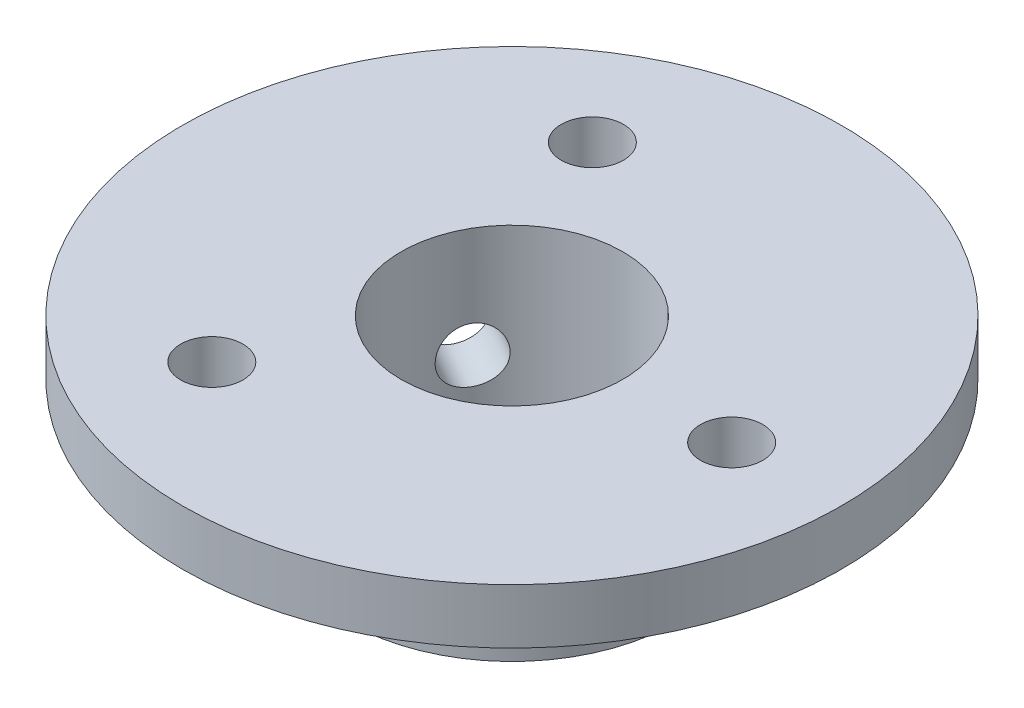
ISO-10303-21;
HEADER;
FILE_DESCRIPTION(('STEP AP214'),'2;1');
FILE_NAME('part.step','',(''),(''),'','','');
FILE_SCHEMA(('AUTOMOTIVE_DESIGN { 1 0 10303 214 1 1 1 1 }'));
ENDSEC;
DATA;
#1=APPLICATION_CONTEXT('core data for automotive mechanical design processes');
#2=APPLICATION_PROTOCOL_DEFINITION('international standard','automotive_design',2000,#1);
#3=PRODUCT_CONTEXT('',#1,'mechanical');
#4=PRODUCT('Part','Part','',(#3));
#5=PRODUCT_RELATED_PRODUCT_CATEGORY('part','',(#4));
#6=PRODUCT_DEFINITION_FORMATION('','',#4);
#7=PRODUCT_DEFINITION_CONTEXT('part definition',#1,'design');
#8=PRODUCT_DEFINITION('design','',#6,#7);
#9=PRODUCT_DEFINITION_SHAPE('','',#8);
#10=(LENGTH_UNIT() NAMED_UNIT(*) SI_UNIT(.MILLI.,.METRE.));
#11=(NAMED_UNIT(*) PLANE_ANGLE_UNIT() SI_UNIT($,.RADIAN.));
#12=(NAMED_UNIT(*) SI_UNIT($,.STERADIAN.) SOLID_ANGLE_UNIT());
#13=UNCERTAINTY_MEASURE_WITH_UNIT(LENGTH_MEASURE(1.E-05),#10,'distance_accuracy_value','');
#14=(GEOMETRIC_REPRESENTATION_CONTEXT(3) GLOBAL_UNCERTAINTY_ASSIGNED_CONTEXT((#13)) GLOBAL_UNIT_ASSIGNED_CONTEXT((#10,
#11,#12)) REPRESENTATION_CONTEXT('',''));
#15=CARTESIAN_POINT('',(0.,0.,0.));
#16=DIRECTION('',(0.,0.,1.));
#17=DIRECTION('',(1.,0.,0.));
#18=AXIS2_PLACEMENT_3D('',#15,#16,#17);
#19=CARTESIAN_POINT('',(-19.0091828831705,-263.,-53.2448828787845));
#20=DIRECTION('',(0.,-1.,0.));
#21=DIRECTION('',(0.,0.,-1.));
#22=AXIS2_PLACEMENT_3D('',#19,#20,#21);
#23=CYLINDRICAL_SURFACE('',#22,9.);
#24=CARTESIAN_POINT('',(-19.0091828831705,-273.,-53.2448828787845));
#25=DIRECTION('',(0.,1.,0.));
#26=DIRECTION('',(0.,0.,1.));
#27=AXIS2_PLACEMENT_3D('',#24,#25,#26);
#28=CIRCLE('',#27,9.);
#29=CARTESIAN_POINT('',(-19.0091828831705,-273.,-44.2448828787845));
#30=VERTEX_POINT('',#29);
#31=EDGE_CURVE('E55',#30,#30,#28,.T.);
#32=ORIENTED_EDGE('',*,*,#31,.T.);
#33=EDGE_LOOP('',(#32));
#34=FACE_BOUND('',#33,.T.);
#35=CARTESIAN_POINT('',(-19.0091828831705,-266.,-53.2448828787845));
#36=DIRECTION('',(0.,1.,0.));
#37=DIRECTION('',(0.,0.,1.));
#38=AXIS2_PLACEMENT_3D('',#35,#36,#37);
#39=CIRCLE('',#38,9.);
#40=CARTESIAN_POINT('',(-19.0091828831705,-266.,-44.2448828787845));
#41=VERTEX_POINT('',#40);
#42=EDGE_CURVE('E10',#41,#41,#39,.T.);
#43=ORIENTED_EDGE('',*,*,#42,.F.);
#44=EDGE_LOOP('',(#43));
#45=FACE_BOUND('',#44,.T.);
#46=CARTESIAN_POINT('',(-27.4443959576402,-269.,-56.3829046104325));
#47=CARTESIAN_POINT('',(-27.4443955846555,-268.916374551112,-56.3829082759775));
#48=CARTESIAN_POINT('',(-27.4419223053393,-268.832703436385,-56.389578863176));
#49=CARTESIAN_POINT('',(-27.4320125045344,-268.667708874068,-56.4160235195044));
#50=CARTESIAN_POINT('',(-27.4245714058764,-268.58638766375,-56.435809672723));
#51=CARTESIAN_POINT('',(-27.4047027066641,-268.428504629986,-56.4877233004097));
#52=CARTESIAN_POINT('',(-27.3922792732431,-268.3519388908,-56.5198404604949));
#53=CARTESIAN_POINT('',(-27.3624238402235,-268.205611427172,-56.5952563986755));
#54=CARTESIAN_POINT('',(-27.3449924042401,-268.135848938254,-56.6385539184453));
#55=CARTESIAN_POINT('',(-27.3049570017537,-268.004412290153,-56.7352822711148));
#56=CARTESIAN_POINT('',(-27.2823087569628,-267.942814921168,-56.7887991358885));
#57=CARTESIAN_POINT('',(-27.2320296164232,-267.830124015883,-56.9039443219727));
#58=CARTESIAN_POINT('',(-27.2043984255415,-267.779031102131,-56.9655731236835));
#59=CARTESIAN_POINT('',(-27.1442291954822,-267.688511259668,-57.0953581877246));
#60=CARTESIAN_POINT('',(-27.1116628481623,-267.649155795361,-57.1635512212972));
#61=CARTESIAN_POINT('',(-27.042228374785,-267.583687357682,-57.303984791282));
#62=CARTESIAN_POINT('',(-27.0053605286255,-267.557573523269,-57.376225064182));
#63=CARTESIAN_POINT('',(-26.9284317459557,-267.51956447901,-57.5218223073512));
#64=CARTESIAN_POINT('',(-26.8884034241198,-267.507540250397,-57.5951628151509));
#65=CARTESIAN_POINT('',(-26.8058722650729,-267.497650547508,-57.7414016906102));
#66=CARTESIAN_POINT('',(-26.763369596251,-267.499784110852,-57.8143000879852));
#67=CARTESIAN_POINT('',(-26.6775772460358,-267.518048810917,-57.9568445310038));
#68=CARTESIAN_POINT('',(-26.6342995292368,-267.534041098046,-58.0265156384673));
#69=CARTESIAN_POINT('',(-26.5479566930274,-267.579350644548,-58.1615193586023));
#70=CARTESIAN_POINT('',(-26.5048915801325,-267.608668309754,-58.226851839069));
#71=CARTESIAN_POINT('',(-26.4202928553399,-267.679934384189,-58.3518562486502));
#72=CARTESIAN_POINT('',(-26.3787671579525,-267.721940007249,-58.4115008921241));
#73=CARTESIAN_POINT('',(-26.2990161854585,-267.817347693581,-58.523430077372));
#74=CARTESIAN_POINT('',(-26.2607911778246,-267.870750679227,-58.5757140228853));
#75=CARTESIAN_POINT('',(-26.1887295067824,-267.988207283972,-58.6723865701703));
#76=CARTESIAN_POINT('',(-26.1549517092287,-268.052382256941,-58.7166716896824));
#77=CARTESIAN_POINT('',(-26.0937997144255,-268.18915225413,-58.7956220923109));
#78=CARTESIAN_POINT('',(-26.066425576245,-268.26174735601,-58.8302872866911));
#79=CARTESIAN_POINT('',(-26.0193142215111,-268.413434985127,-58.8893042877897));
#80=CARTESIAN_POINT('',(-25.9995855931814,-268.492534698855,-58.9136444993096));
#81=CARTESIAN_POINT('',(-25.9687753955772,-268.654909443385,-58.9514293115988));
#82=CARTESIAN_POINT('',(-25.9576930649258,-268.73818410586,-58.9648748717346));
#83=CARTESIAN_POINT('',(-25.9448151899855,-268.905479693697,-58.9804828538303));
#84=CARTESIAN_POINT('',(-25.9429103119665,-268.989479827821,-58.98277811538));
#85=CARTESIAN_POINT('',(-25.9481869744816,-269.156772003015,-58.9763956560938));
#86=CARTESIAN_POINT('',(-25.9553681640573,-269.240064071308,-58.9677183590838));
#87=CARTESIAN_POINT('',(-25.9783808858867,-269.403036655515,-58.9396700995327));
#88=CARTESIAN_POINT('',(-25.9941574120271,-269.482736683927,-58.9203671282506));
#89=CARTESIAN_POINT('',(-26.0335649390486,-269.636882099768,-58.8715191422945));
#90=CARTESIAN_POINT('',(-26.0571964097995,-269.711327172531,-58.8419735149173));
#91=CARTESIAN_POINT('',(-26.1114846218793,-269.853604756644,-58.7729249574249));
#92=CARTESIAN_POINT('',(-26.1422041504897,-269.921369943654,-58.7333326995224));
#93=CARTESIAN_POINT('',(-26.2092002877539,-270.047668119617,-58.6451429188243));
#94=CARTESIAN_POINT('',(-26.2454772872466,-270.106200458666,-58.5965447626223));
#95=CARTESIAN_POINT('',(-26.3224923998484,-270.212991135637,-58.4908162898407));
#96=CARTESIAN_POINT('',(-26.3632729839541,-270.261136295771,-58.433602496924));
#97=CARTESIAN_POINT('',(-26.4473588613692,-270.344993196203,-58.3123255181014));
#98=CARTESIAN_POINT('',(-26.490664072959,-270.380705338684,-58.2482625538398));
#99=CARTESIAN_POINT('',(-26.5779837345088,-270.438506350373,-58.115155549931));
#100=CARTESIAN_POINT('',(-26.6219942274918,-270.460654445441,-58.0461346567948));
#101=CARTESIAN_POINT('',(-26.7093803081369,-270.490889359378,-57.9046967084631));
#102=CARTESIAN_POINT('',(-26.7527559477492,-270.498977335239,-57.8322799332145));
#103=CARTESIAN_POINT('',(-26.8369936083392,-270.500829129387,-57.6869934454136));
#104=CARTESIAN_POINT('',(-26.8778797003691,-270.494765152365,-57.6141398263318));
#105=CARTESIAN_POINT('',(-26.9566077376737,-270.468857646638,-57.4692453820966));
#106=CARTESIAN_POINT('',(-26.994449699993,-270.449014195094,-57.3972045523942));
#107=CARTESIAN_POINT('',(-27.0662175392359,-270.396177100674,-57.2561733620671));
#108=CARTESIAN_POINT('',(-27.1001477222312,-270.363198099074,-57.1871796997767));
#109=CARTESIAN_POINT('',(-27.1635774092855,-270.285045238262,-57.05425033712));
#110=CARTESIAN_POINT('',(-27.1930767032088,-270.239870800963,-56.9903148767077));
#111=CARTESIAN_POINT('',(-27.2476192889897,-270.137998944523,-56.8687840044083));
#112=CARTESIAN_POINT('',(-27.2726076517893,-270.081175427146,-56.8112696296225));
#113=CARTESIAN_POINT('',(-27.3175452583329,-269.957883015261,-56.7052927569666));
#114=CARTESIAN_POINT('',(-27.3374933204094,-269.891411864665,-56.6568323824438));
#115=CARTESIAN_POINT('',(-27.3724177907865,-269.750152806495,-56.5703152260012));
#116=CARTESIAN_POINT('',(-27.3873580339418,-269.675309396097,-56.5323344587124));
#117=CARTESIAN_POINT('',(-27.4120729545346,-269.519834458453,-56.468640867427));
#118=CARTESIAN_POINT('',(-27.4218527931616,-269.439208806382,-56.4429157883894));
#119=CARTESIAN_POINT('',(-27.4341856321772,-269.298557738314,-56.4102470016508));
#120=CARTESIAN_POINT('',(-27.4380145649149,-269.239383915225,-56.4000136386093));
#121=CARTESIAN_POINT('',(-27.4431198384733,-269.120147909095,-56.3863411878055));
#122=CARTESIAN_POINT('',(-27.4443962256336,-269.060085742202,-56.3829019767009));
#123=CARTESIAN_POINT('',(-27.4443959576402,-269.,-56.3829046104325));
#124=B_SPLINE_CURVE_WITH_KNOTS('',3,(#46,#47,#48,#49,#50,#51,#52,#53,#54,#55,#56,#57,#58,#59,
#60,#61,#62,#63,#64,#65,#66,#67,#68,#69,#70,#71,#72,#73,#74,#75,#76,#77,#78,#79,#80,#81,#82,#83,
#84,#85,#86,#87,#88,#89,#90,#91,#92,#93,#94,#95,#96,#97,#98,#99,#100,#101,#102,#103,#104,#105,
#106,#107,#108,#109,#110,#111,#112,#113,#114,#115,#116,#117,#118,#119,#120,#121,#122,#123),
.UNSPECIFIED.,.T.,.F.,(4,2,2,2,2,2,2,2,2,2,2,2,2,2,2,2,2,2,2,2,2,2,2,2,2,2,2,2,2,2,2,2,2,2,2,2,
2,2,4),(0.,0.250656623343192,0.501544511951688,0.75222299869901,1.00287328440552,
1.25573495490819,1.5086116069806,1.76299788064252,2.01736761064057,2.26938940480931,
2.52139406789009,2.77090272696194,3.02041898547112,3.27107762481046,3.52175655733452,
3.77547674074667,4.02919926444999,4.28320597496554,4.5371903156024,4.78814125449642,
5.03908250045775,5.28843638778686,5.53780519373538,5.7894740565501,6.04116062655806,
6.29546467818619,6.54976050283407,6.80293790647976,7.05609447544802,7.30618665756942,
7.55627743928687,7.80609023896866,8.05591488232793,8.30860198475348,8.56134827326482,
8.81588236567711,9.07016140042584,9.25026402322166,9.43036337636995),.UNSPECIFIED.);
#125=CARTESIAN_POINT('',(-27.4443959576402,-269.,-56.3829046104325));
#126=VERTEX_POINT('',#125);
#127=EDGE_CURVE('E100',#126,#126,#124,.T.);
#128=ORIENTED_EDGE('',*,*,#127,.F.);
#129=EDGE_LOOP('',(#128));
#130=FACE_BOUND('',#129,.T.);
#131=CARTESIAN_POINT('',(-12.0739698087008,-269.,-47.5087849357831));
#132=CARTESIAN_POINT('',(-12.0739668207381,-269.083625448888,-47.5087870915698));
#133=CARTESIAN_POINT('',(-12.0694265624242,-269.167296563615,-47.5142643078876));
#134=CARTESIAN_POINT('',(-12.0514797186519,-269.332291125932,-47.5360687752953));
#135=CARTESIAN_POINT('',(-12.0380649566504,-269.41361233625,-47.5524060323744));
#136=CARTESIAN_POINT('',(-12.0030407858772,-269.571495370014,-47.5955696444758));
#137=CARTESIAN_POINT('',(-11.9814382260566,-269.6480611092,-47.6223872334632));
#138=CARTESIAN_POINT('',(-11.9310538242517,-269.794388572828,-47.6859507659894));
#139=CARTESIAN_POINT('',(-11.9022727902019,-269.864151061746,-47.7226955922605));
#140=CARTESIAN_POINT('',(-11.8385212807671,-269.995587709847,-47.8057314441991));
#141=CARTESIAN_POINT('',(-11.8034984387377,-270.057185078832,-47.8521038319261));
#142=CARTESIAN_POINT('',(-11.7289193527351,-270.169875984117,-47.9532194379559));
#143=CARTESIAN_POINT('',(-11.6893628402895,-270.220968897869,-48.0079631520517));
#144=CARTESIAN_POINT('',(-11.6070502928279,-270.311488740332,-48.1249637658297));
#145=CARTESIAN_POINT('',(-11.5642765670528,-270.350844204639,-48.1872635667035));
#146=CARTESIAN_POINT('',(-11.4773747645904,-270.416312642318,-48.3176123695391));
#147=CARTESIAN_POINT('',(-11.4332467761624,-270.442426476731,-48.385660997346));
#148=CARTESIAN_POINT('',(-11.3456202561919,-270.48043552099,-48.5250818990049));
#149=CARTESIAN_POINT('',(-11.3021196742288,-270.492459749603,-48.5964176964855));
#150=CARTESIAN_POINT('',(-11.2167386725836,-270.502349452492,-48.7410112145535));
#151=CARTESIAN_POINT('',(-11.1748581429726,-270.500215889148,-48.8142688041694));
#152=CARTESIAN_POINT('',(-11.0943072092579,-270.481951189083,-48.9598393804154));
#153=CARTESIAN_POINT('',(-11.0556091186842,-270.465958901955,-49.0321545363129));
#154=CARTESIAN_POINT('',(-10.9818638855465,-270.420649355452,-49.1744314859725));
#155=CARTESIAN_POINT('',(-10.9468168542176,-270.391331690246,-49.2443932079897));
#156=CARTESIAN_POINT('',(-10.8808592223315,-270.320065615811,-49.3801600575784));
#157=CARTESIAN_POINT('',(-10.8499682945772,-270.278059992751,-49.4459446881628));
#158=CARTESIAN_POINT('',(-10.7929102629745,-270.182652306419,-49.570975648943));
#159=CARTESIAN_POINT('',(-10.7667435417669,-270.129249320773,-49.6302214493705));
#160=CARTESIAN_POINT('',(-10.7190534954907,-270.011792716028,-49.7409649607747));
#161=CARTESIAN_POINT('',(-10.6975903557604,-269.947617743059,-49.7923599512962));
#162=CARTESIAN_POINT('',(-10.6597932988467,-269.81084774587,-49.8847943336021));
#163=CARTESIAN_POINT('',(-10.6434594289765,-269.73825264399,-49.9258336298632));
#164=CARTESIAN_POINT('',(-10.615904884137,-269.586565014873,-49.9961417604188));
#165=CARTESIAN_POINT('',(-10.6046899567921,-269.507465301145,-50.025397359494));
#166=CARTESIAN_POINT('',(-10.5873724482745,-269.345090556616,-50.0709721794595));
#167=CARTESIAN_POINT('',(-10.5812694169545,-269.261815894141,-50.0872925394047));
#168=CARTESIAN_POINT('',(-10.574191445428,-269.094520306303,-50.1062490972976));
#169=CARTESIAN_POINT('',(-10.5731561296271,-269.010520172179,-50.109046400828));
#170=CARTESIAN_POINT('',(-10.57604517025,-268.843227996985,-50.1012854473996));
#171=CARTESIAN_POINT('',(-10.579969335109,-268.759935928692,-50.0907277062927));
#172=CARTESIAN_POINT('',(-10.5927534794975,-268.596963344485,-50.0567739748026));
#173=CARTESIAN_POINT('',(-10.6015820799261,-268.517263316073,-50.0334596167405));
#174=CARTESIAN_POINT('',(-10.6241819131771,-268.363117900232,-49.9749077042615));
#175=CARTESIAN_POINT('',(-10.637953441681,-268.288672827469,-49.9396694365739));
#176=CARTESIAN_POINT('',(-10.6706071405242,-268.146395243356,-49.8581301870405));
#177=CARTESIAN_POINT('',(-10.6895352773557,-268.078630056346,-49.8117301659203));
#178=CARTESIAN_POINT('',(-10.7324117991624,-267.952331880383,-49.7096149187451));
#179=CARTESIAN_POINT('',(-10.756360537264,-267.893799541334,-49.6538990375103));
#180=CARTESIAN_POINT('',(-10.8094165242954,-267.787008864363,-49.5343377571311));
#181=CARTESIAN_POINT('',(-10.8385748303552,-267.738863704229,-49.470413838856));
#182=CARTESIAN_POINT('',(-10.9015608362023,-267.655006803797,-49.3369548435037));
#183=CARTESIAN_POINT('',(-10.9353883848997,-267.619294661316,-49.2674199480199));
#184=CARTESIAN_POINT('',(-11.0070026009314,-267.561493649627,-49.1252454009135));
#185=CARTESIAN_POINT('',(-11.0447712012877,-267.539345554559,-49.0526207493891));
#186=CARTESIAN_POINT('',(-11.1235670172796,-267.509110640622,-48.9062232094474));
#187=CARTESIAN_POINT('',(-11.1645939644989,-267.501022664761,-48.8324504160134));
#188=CARTESIAN_POINT('',(-11.2482969234661,-267.499170870613,-48.6868552180867));
#189=CARTESIAN_POINT('',(-11.2909469623336,-267.505234847635,-48.6150200141864));
#190=CARTESIAN_POINT('',(-11.3770652132562,-267.531142353362,-48.4743923117729));
#191=CARTESIAN_POINT('',(-11.4205334207286,-267.550985804906,-48.4055997962242));
#192=CARTESIAN_POINT('',(-11.5067860946564,-267.603822899326,-48.2729314291016));
#193=CARTESIAN_POINT('',(-11.5495712674023,-267.636801900926,-48.2090501975274));
#194=CARTESIAN_POINT('',(-11.6329766288447,-267.714954761738,-48.0876537958559));
#195=CARTESIAN_POINT('',(-11.6735967148027,-267.760129199037,-48.0301389277185));
#196=CARTESIAN_POINT('',(-11.7515742446677,-267.862001055477,-47.9221382266944));
#197=CARTESIAN_POINT('',(-11.7888889729152,-267.918824572854,-47.8717404823181));
#198=CARTESIAN_POINT('',(-11.858198833577,-268.042116984739,-47.7798349371381));
#199=CARTESIAN_POINT('',(-11.8901927179524,-268.108588135335,-47.7383292213622));
#200=CARTESIAN_POINT('',(-11.9476565381064,-268.249847193505,-47.6648251645806));
#201=CARTESIAN_POINT('',(-11.973078725856,-268.324690603903,-47.632896150825));
#202=CARTESIAN_POINT('',(-12.015881533671,-268.480165541547,-47.5796456060964));
#203=CARTESIAN_POINT('',(-12.0332701863185,-268.560791193618,-47.5583134778818));
#204=CARTESIAN_POINT('',(-12.0553957660371,-268.701442261686,-47.5312985326241));
#205=CARTESIAN_POINT('',(-12.0623436520284,-268.760616084775,-47.5228658980832));
#206=CARTESIAN_POINT('',(-12.0716317049772,-268.879852090905,-47.5116083760864));
#207=CARTESIAN_POINT('',(-12.0739719555826,-268.939914257798,-47.5087833868283));
#208=CARTESIAN_POINT('',(-12.0739698087008,-269.,-47.5087849357831));
#209=B_SPLINE_CURVE_WITH_KNOTS('',3,(#131,#132,#133,#134,#135,#136,#137,#138,#139,#140,#141,
#142,#143,#144,#145,#146,#147,#148,#149,#150,#151,#152,#153,#154,#155,#156,#157,#158,#159,#160,
#161,#162,#163,#164,#165,#166,#167,#168,#169,#170,#171,#172,#173,#174,#175,#176,#177,#178,#179,
#180,#181,#182,#183,#184,#185,#186,#187,#188,#189,#190,#191,#192,#193,#194,#195,#196,#197,#198,
#199,#200,#201,#202,#203,#204,#205,#206,#207,#208),.UNSPECIFIED.,.T.,.F.,(4,2,2,2,2,2,2,2,2,2,2,
2,2,2,2,2,2,2,2,2,2,2,2,2,2,2,2,2,2,2,2,2,2,2,2,2,2,2,4),(0.,0.250656623343192,
0.501544511951688,0.75222299869901,1.00287328440552,1.25573495490819,1.5086116069806,
1.76299788064251,2.01736761064058,2.26938940480931,2.52139406789008,2.77090272696194,
3.02041898547112,3.27107762481046,3.52175655733452,3.77547674074669,4.02919926445006,
4.28320597496555,4.53719031560235,4.78814125449637,5.03908250045781,5.28843638778687,
5.53780519373538,5.78947405655011,6.04116062655806,6.2954646781862,6.54976050283408,
6.80293790647979,7.05609447544804,7.30618665756944,7.55627743928688,7.80609023896868,
8.05591488232794,8.30860198475347,8.56134827326483,8.81588236567717,9.07016140042584,
9.25026402322172,9.43036337636996),.UNSPECIFIED.);
#210=CARTESIAN_POINT('',(-12.0739698087008,-269.,-47.5087849357831));
#211=VERTEX_POINT('',#210);
#212=EDGE_CURVE('E69',#211,#211,#209,.T.);
#213=ORIENTED_EDGE('',*,*,#212,.F.);
#214=EDGE_LOOP('',(#213));
#215=FACE_BOUND('',#214,.T.);
#216=ADVANCED_FACE('F39',(#34,#45,#130,#215),#23,.T.);
#217=CARTESIAN_POINT('',(-19.0091828831705,-262.9,-53.2448828787845));
#218=DIRECTION('',(0.,-1.,0.));
#219=DIRECTION('',(0.,0.,-1.));
#220=AXIS2_PLACEMENT_3D('',#217,#218,#219);
#221=CYLINDRICAL_SURFACE('',#220,6.05);
#222=CARTESIAN_POINT('',(-24.8350448789305,-269.,-54.8763950627292));
#223=CARTESIAN_POINT('',(-24.8350450633985,-268.917145871372,-54.8763979320863));
#224=CARTESIAN_POINT('',(-24.8331388938054,-268.83426511614,-54.8832484358918));
#225=CARTESIAN_POINT('',(-24.8254452254222,-268.670882052661,-54.9103509568516));
#226=CARTESIAN_POINT('',(-24.8196554299351,-268.590381181258,-54.930610903983));
#227=CARTESIAN_POINT('',(-24.8040130372753,-268.434144766549,-54.9836182037655));
#228=CARTESIAN_POINT('',(-24.7941656282341,-268.358403279826,-55.0163496061995));
#229=CARTESIAN_POINT('',(-24.7701365726022,-268.213569094319,-55.092995111845));
#230=CARTESIAN_POINT('',(-24.7559547606416,-268.144476649346,-55.136909641714));
#231=CARTESIAN_POINT('',(-24.7226346416272,-268.013406159432,-55.2352876924835));
#232=CARTESIAN_POINT('',(-24.7034050162067,-267.951593249911,-55.2899403392969));
#233=CARTESIAN_POINT('',(-24.6598652875304,-267.838290682976,-55.4073354940556));
#234=CARTESIAN_POINT('',(-24.6355547156717,-267.786801978596,-55.4700787479727));
#235=CARTESIAN_POINT('',(-24.5813733602019,-267.694935328621,-55.6025030570667));
#236=CARTESIAN_POINT('',(-24.5514309218313,-267.654719373618,-55.6722674293788));
#237=CARTESIAN_POINT('',(-24.4863792754456,-267.587592712703,-55.8156824422294));
#238=CARTESIAN_POINT('',(-24.451270817782,-267.560680076987,-55.8893325173844));
#239=CARTESIAN_POINT('',(-24.3771809586197,-267.521452276688,-56.0366123488901));
#240=CARTESIAN_POINT('',(-24.3382907397042,-267.508856747212,-56.1102132286142));
#241=CARTESIAN_POINT('',(-24.2569934948733,-267.497740893098,-56.2565241740754));
#242=CARTESIAN_POINT('',(-24.2145869815761,-267.499218520387,-56.3292343678923));
#243=CARTESIAN_POINT('',(-24.1285014330235,-267.516004889703,-56.4700563567304));
#244=CARTESIAN_POINT('',(-24.0848703763516,-267.531011035916,-56.5382338805729));
#245=CARTESIAN_POINT('',(-23.9969491341835,-267.573942381363,-56.6699318903674));
#246=CARTESIAN_POINT('',(-23.9526589140462,-267.601868261907,-56.7334521305176));
#247=CARTESIAN_POINT('',(-23.8646572595089,-267.670092763352,-56.8549452882894));
#248=CARTESIAN_POINT('',(-23.8209545153478,-267.710499557116,-56.9128636528494));
#249=CARTESIAN_POINT('',(-23.736264902453,-267.802456929857,-57.0213813356442));
#250=CARTESIAN_POINT('',(-23.6952785008274,-267.854009419009,-57.0719793968246));
#251=CARTESIAN_POINT('',(-23.6167176125377,-267.968418739372,-57.1662338103556));
#252=CARTESIAN_POINT('',(-23.5792630410344,-268.031540031227,-57.2096694401291));
#253=CARTESIAN_POINT('',(-23.5108334886642,-268.166447544473,-57.2871994740126));
#254=CARTESIAN_POINT('',(-23.4798588005152,-268.238234157074,-57.3212934561507));
#255=CARTESIAN_POINT('',(-23.4258881891325,-268.388921008808,-57.3797118605887));
#256=CARTESIAN_POINT('',(-23.402930465209,-268.467853107807,-57.403989594661));
#257=CARTESIAN_POINT('',(-23.366540965744,-268.630299513716,-57.4421000954008));
#258=CARTESIAN_POINT('',(-23.3531071897388,-268.713812854385,-57.4559350555668));
#259=CARTESIAN_POINT('',(-23.3368161357506,-268.88072474514,-57.4726747893412));
#260=CARTESIAN_POINT('',(-23.3336930087933,-268.964069849902,-57.4758543346462));
#261=CARTESIAN_POINT('',(-23.3374677961823,-269.130289310283,-57.4719926504449));
#262=CARTESIAN_POINT('',(-23.3443648049192,-269.213163707763,-57.4649523445981));
#263=CARTESIAN_POINT('',(-23.3675655787072,-269.374718130252,-57.4409844251751));
#264=CARTESIAN_POINT('',(-23.3837167785055,-269.453444096,-57.424217117048));
#265=CARTESIAN_POINT('',(-23.4243967755724,-269.605990866611,-57.3812166133983));
#266=CARTESIAN_POINT('',(-23.4489265526,-269.679811096609,-57.3549823108211));
#267=CARTESIAN_POINT('',(-23.5056335718447,-269.822024713169,-57.2928733449973));
#268=CARTESIAN_POINT('',(-23.5379494671799,-269.89028562448,-57.2568221448304));
#269=CARTESIAN_POINT('',(-23.6083755456353,-270.018024313333,-57.1758876509572));
#270=CARTESIAN_POINT('',(-23.6464866644314,-270.077500669491,-57.1310029306775));
#271=CARTESIAN_POINT('',(-23.727772536656,-270.187479914155,-57.0319147257517));
#272=CARTESIAN_POINT('',(-23.7710486775083,-270.237726490308,-56.9775094175847));
#273=CARTESIAN_POINT('',(-23.8599666809402,-270.325960338467,-56.8611996532621));
#274=CARTESIAN_POINT('',(-23.9056084205376,-270.363948247033,-56.7992955867269));
#275=CARTESIAN_POINT('',(-23.9970265289423,-270.426259322716,-56.6698127715526));
#276=CARTESIAN_POINT('',(-24.0427994860794,-270.450680162875,-56.6022787192659));
#277=CARTESIAN_POINT('',(-24.1330462688226,-270.485458073156,-56.4628653761341));
#278=CARTESIAN_POINT('',(-24.1775203391816,-270.495817809803,-56.3909869118577));
#279=CARTESIAN_POINT('',(-24.2624923341831,-270.502031514408,-56.2468908046009));
#280=CARTESIAN_POINT('',(-24.3030645594155,-270.498264033302,-56.1747330503417));
#281=CARTESIAN_POINT('',(-24.3804265364585,-270.477195886485,-56.030371866503));
#282=CARTESIAN_POINT('',(-24.4172163973577,-270.459895611202,-55.9581684383013));
#283=CARTESIAN_POINT('',(-24.486095370606,-270.412454589756,-55.8162875322755));
#284=CARTESIAN_POINT('',(-24.5182079972697,-270.382381278526,-55.7465988450935));
#285=CARTESIAN_POINT('',(-24.5775998405927,-270.310309234355,-55.6114599557539));
#286=CARTESIAN_POINT('',(-24.6048784561424,-270.268309019989,-55.5460102813589));
#287=CARTESIAN_POINT('',(-24.6551214184374,-270.172415313698,-55.4198771609174));
#288=CARTESIAN_POINT('',(-24.6779686269354,-270.118264305729,-55.3593428307888));
#289=CARTESIAN_POINT('',(-24.7186879397711,-270.000107510859,-55.2467925003856));
#290=CARTESIAN_POINT('',(-24.7365587866343,-269.936099239464,-55.1947786545129));
#291=CARTESIAN_POINT('',(-24.7678858849438,-269.798637306859,-55.1002456268818));
#292=CARTESIAN_POINT('',(-24.7812555255557,-269.725032456485,-55.0579172542834));
#293=CARTESIAN_POINT('',(-24.803444606581,-269.571354258327,-54.9857068801794));
#294=CARTESIAN_POINT('',(-24.8122673975113,-269.491285724021,-54.9558157169866));
#295=CARTESIAN_POINT('',(-24.8243633753481,-269.34278419005,-54.9141780976986));
#296=CARTESIAN_POINT('',(-24.8283768790743,-269.275069134371,-54.9000496540044));
#297=CARTESIAN_POINT('',(-24.8337174434205,-269.138242154339,-54.8811573246245));
#298=CARTESIAN_POINT('',(-24.8350447250173,-269.069130345359,-54.8763926686464));
#299=CARTESIAN_POINT('',(-24.8350448789305,-269.,-54.8763950627292));
#300=B_SPLINE_CURVE_WITH_KNOTS('',3,(#222,#223,#224,#225,#226,#227,#228,#229,#230,#231,#232,
#233,#234,#235,#236,#237,#238,#239,#240,#241,#242,#243,#244,#245,#246,#247,#248,#249,#250,#251,
#252,#253,#254,#255,#256,#257,#258,#259,#260,#261,#262,#263,#264,#265,#266,#267,#268,#269,#270,
#271,#272,#273,#274,#275,#276,#277,#278,#279,#280,#281,#282,#283,#284,#285,#286,#287,#288,#289,
#290,#291,#292,#293,#294,#295,#296,#297,#298,#299),.UNSPECIFIED.,.T.,.F.,(4,2,2,2,2,2,2,2,2,2,2,
2,2,2,2,2,2,2,2,2,2,2,2,2,2,2,2,2,2,2,2,2,2,2,2,2,2,2,4),(0.,0.248308555378135,
0.496764084985487,0.744902916216995,0.993051215830459,1.24604175182043,1.49905563079245,
1.75553800799941,2.01198316847504,2.26331496642091,2.51461018850565,2.7604203878838,
3.00624355129862,3.25426007800213,3.50231914408442,3.75698358308596,4.01165952364873,
4.26753289950156,4.52335251433646,4.77252234046924,5.0216696482933,5.26682305522699,
5.5120051392892,5.76192634197366,6.01188793896218,6.26798960627747,6.52407797276703,
6.77829797232378,7.03246975527181,7.27988006564556,7.52728323836721,7.77339617740614,
8.01953969916321,8.271497849543,8.52351960945305,8.78014536003374,9.03658173491867,
9.24377802972126,9.45095727924298),.UNSPECIFIED.);
#301=CARTESIAN_POINT('',(-24.8350448789305,-269.,-54.8763950627292));
#302=VERTEX_POINT('',#301);
#303=EDGE_CURVE('E80',#302,#302,#300,.T.);
#304=ORIENTED_EDGE('',*,*,#303,.T.);
#305=EDGE_LOOP('',(#304));
#306=FACE_BOUND('',#305,.T.);
#307=CARTESIAN_POINT('',(-19.0091828831705,-263.,-53.2448828787845));
#308=DIRECTION('',(0.,1.,0.));
#309=DIRECTION('',(0.,0.,1.));
#310=AXIS2_PLACEMENT_3D('',#307,#308,#309);
#311=CIRCLE('',#310,6.05);
#312=CARTESIAN_POINT('',(-19.0091828831705,-263.,-47.1948828787845));
#313=VERTEX_POINT('',#312);
#314=EDGE_CURVE('E62',#313,#313,#311,.F.);
#315=ORIENTED_EDGE('',*,*,#314,.F.);
#316=EDGE_LOOP('',(#315));
#317=FACE_BOUND('',#316,.T.);
#318=CARTESIAN_POINT('',(-19.0091828831705,-273.,-53.2448828787845));
#319=DIRECTION('',(0.,1.,0.));
#320=DIRECTION('',(0.,0.,1.));
#321=AXIS2_PLACEMENT_3D('',#318,#319,#320);
#322=CIRCLE('',#321,6.05);
#323=CARTESIAN_POINT('',(-19.0091828831705,-273.,-47.1948828787845));
#324=VERTEX_POINT('',#323);
#325=EDGE_CURVE('E61',#324,#324,#322,.F.);
#326=ORIENTED_EDGE('',*,*,#325,.T.);
#327=EDGE_LOOP('',(#326));
#328=FACE_BOUND('',#327,.T.);
#329=CARTESIAN_POINT('',(-14.6833208874106,-269.,-49.0152944834864));
#330=CARTESIAN_POINT('',(-14.6833183102404,-269.082854128628,-49.0152957584109));
#331=CARTESIAN_POINT('',(-14.6783386847127,-269.16573488386,-49.0203718016053));
#332=CARTESIAN_POINT('',(-14.6587140472465,-269.329117947339,-49.0405859743533));
#333=CARTESIAN_POINT('',(-14.644063316095,-269.409618818742,-49.0557300578936));
#334=CARTESIAN_POINT('',(-14.6059788442272,-269.565855233451,-49.0957804172042));
#335=CARTESIAN_POINT('',(-14.5825563227385,-269.641596720174,-49.1206742248123));
#336=CARTESIAN_POINT('',(-14.5281938955795,-269.786430905681,-49.1798067502413));
#337=CARTESIAN_POINT('',(-14.497253703098,-269.855523350654,-49.2140458246053));
#338=CARTESIAN_POINT('',(-14.428715871464,-269.986593840568,-49.2920909195136));
#339=CARTESIAN_POINT('',(-14.3910001036498,-270.048406750089,-49.3360705870397));
#340=CARTESIAN_POINT('',(-14.3111027816857,-270.161709317024,-49.4324746755267));
#341=CARTESIAN_POINT('',(-14.2689208158068,-270.213198021404,-49.4848998752954));
#342=CARTESIAN_POINT('',(-14.1813286777876,-270.305064671379,-49.5980344600907));
#343=CARTESIAN_POINT('',(-14.1358821782716,-270.345280626382,-49.6588475585269));
#344=CARTESIAN_POINT('',(-14.0442069570517,-270.412407287297,-49.7868914432803));
#345=CARTESIAN_POINT('',(-13.9979783498087,-270.439319923013,-49.8541212970821));
#346=CARTESIAN_POINT('',(-13.9074752038408,-270.478547723312,-49.9919249130324));
#347=CARTESIAN_POINT('',(-13.8631800817166,-270.491143252788,-50.062405270434));
#348=CARTESIAN_POINT('',(-13.777119708511,-270.502259106902,-50.2059662224458));
#349=CARTESIAN_POINT('',(-13.7353540902,-270.500781479613,-50.2790464371555));
#350=CARTESIAN_POINT('',(-13.656441444731,-270.483995110297,-50.4240097035199));
#351=CARTESIAN_POINT('',(-13.6192135054523,-270.468988964084,-50.4958840689129));
#352=CARTESIAN_POINT('',(-13.5491203044264,-270.426057618637,-50.63787510306));
#353=CARTESIAN_POINT('',(-13.5162552728705,-270.398131738093,-50.7079916789133));
#354=CARTESIAN_POINT('',(-13.4550399391228,-270.329907236648,-50.8449499262035));
#355=CARTESIAN_POINT('',(-13.4267325361488,-270.289500442884,-50.9117567951421));
#356=CARTESIAN_POINT('',(-13.375098272536,-270.197543070143,-51.0393589927431));
#357=CARTESIAN_POINT('',(-13.3517722669844,-270.145990580991,-51.1001532883508));
#358=CARTESIAN_POINT('',(-13.3094259945926,-270.031581260628,-51.215316220119));
#359=CARTESIAN_POINT('',(-13.290536921531,-269.968459968773,-51.2694706454154));
#360=CARTESIAN_POINT('',(-13.2576087188167,-269.833552455527,-51.3674973930794));
#361=CARTESIAN_POINT('',(-13.2435698082435,-269.761765842926,-51.4113692509598));
#362=CARTESIAN_POINT('',(-13.219963291643,-269.611078991192,-51.487318373694));
#363=CARTESIAN_POINT('',(-13.2104170191517,-269.532146892194,-51.5193392128609));
#364=CARTESIAN_POINT('',(-13.1956071070926,-269.369700486284,-51.5699086941986));
#365=CARTESIAN_POINT('',(-13.1903425681312,-269.286187145615,-51.5884601655708));
#366=CARTESIAN_POINT('',(-13.183991060424,-269.11927525486,-51.6109384990662));
#367=CARTESIAN_POINT('',(-13.182799056896,-269.035930150098,-51.615232979003));
#368=CARTESIAN_POINT('',(-13.1842559798213,-268.869710689717,-51.6100330751296));
#369=CARTESIAN_POINT('',(-13.1869045591666,-268.786836292237,-51.6005399374299));
#370=CARTESIAN_POINT('',(-13.1960609993688,-268.625281869748,-51.5684635182306));
#371=CARTESIAN_POINT('',(-13.2025063142607,-268.546555904,-51.5460925148401));
#372=CARTESIAN_POINT('',(-13.2194058442634,-268.394009133389,-51.4893623521294));
#373=CARTESIAN_POINT('',(-13.2298605282321,-268.320188903391,-51.4550017907857));
#374=CARTESIAN_POINT('',(-13.2552949608159,-268.177975286831,-51.374837588635));
#375=CARTESIAN_POINT('',(-13.2703582683298,-268.10971437552,-51.3288256022453));
#376=CARTESIAN_POINT('',(-13.3052365568387,-267.981975686667,-51.2273675822773));
#377=CARTESIAN_POINT('',(-13.3250523054446,-267.922499330509,-51.1719200250934));
#378=CARTESIAN_POINT('',(-13.3702222720135,-267.812520085845,-51.0519802923153));
#379=CARTESIAN_POINT('',(-13.3957005805607,-267.762273509692,-50.9872994008759));
#380=CARTESIAN_POINT('',(-13.4519687894563,-267.674039661533,-50.8521392688888));
#381=CARTESIAN_POINT('',(-13.4827584138746,-267.636051752967,-50.781660329657));
#382=CARTESIAN_POINT('',(-13.5491847669667,-267.573740677284,-50.6377485178254));
#383=CARTESIAN_POINT('',(-13.584784493299,-267.549319837125,-50.564340947995));
#384=CARTESIAN_POINT('',(-13.660396598706,-267.514541926844,-50.4164782699637));
#385=CARTESIAN_POINT('',(-13.7004081395749,-267.504182190197,-50.3420233630848));
#386=CARTESIAN_POINT('',(-13.782713031545,-267.497968485592,-50.1963874031749));
#387=CARTESIAN_POINT('',(-13.8249173671973,-267.501735966698,-50.125171948306));
#388=CARTESIAN_POINT('',(-13.9112568312005,-267.522804113515,-49.9859939189804));
#389=CARTESIAN_POINT('',(-13.9553919038139,-267.540104388798,-49.9180312507392));
#390=CARTESIAN_POINT('',(-14.04382488612,-267.587545410244,-49.7874398571066));
#391=CARTESIAN_POINT('',(-14.0881207462442,-267.617618721474,-49.7247851630426));
#392=CARTESIAN_POINT('',(-14.17545853579,-267.689690765645,-49.6057808732775));
#393=CARTESIAN_POINT('',(-14.2185003087107,-267.731690980011,-49.5494320620339));
#394=CARTESIAN_POINT('',(-14.3026133141241,-267.827584686302,-49.4428538201043));
#395=CARTESIAN_POINT('',(-14.3436139775676,-267.881735694271,-49.3928003920752));
#396=CARTESIAN_POINT('',(-14.4207257664831,-267.999892489141,-49.3012612675332));
#397=CARTESIAN_POINT('',(-14.4568356549259,-268.063900760536,-49.2597777372262));
#398=CARTESIAN_POINT('',(-14.5230401091963,-268.201362693141,-49.1853811604478));
#399=CARTESIAN_POINT('',(-14.5530127348614,-268.274967543515,-49.1526385257392));
#400=CARTESIAN_POINT('',(-14.6044542127396,-268.428645741673,-49.0973170308327));
#401=CARTESIAN_POINT('',(-14.6259293239482,-268.508714275979,-49.0747306881584));
#402=CARTESIAN_POINT('',(-14.6559405710863,-268.65721580995,-49.043436454424));
#403=CARTESIAN_POINT('',(-14.6661694103782,-268.724930865629,-49.0328964363919));
#404=CARTESIAN_POINT('',(-14.6798603653848,-268.861757845661,-49.0188252073075));
#405=CARTESIAN_POINT('',(-14.6833230377037,-268.930869654641,-49.0152934197377));
#406=CARTESIAN_POINT('',(-14.6833208874106,-269.,-49.0152944834864));
#407=B_SPLINE_CURVE_WITH_KNOTS('',3,(#329,#330,#331,#332,#333,#334,#335,#336,#337,#338,#339,
#340,#341,#342,#343,#344,#345,#346,#347,#348,#349,#350,#351,#352,#353,#354,#355,#356,#357,#358,
#359,#360,#361,#362,#363,#364,#365,#366,#367,#368,#369,#370,#371,#372,#373,#374,#375,#376,#377,
#378,#379,#380,#381,#382,#383,#384,#385,#386,#387,#388,#389,#390,#391,#392,#393,#394,#395,#396,
#397,#398,#399,#400,#401,#402,#403,#404,#405,#406),.UNSPECIFIED.,.T.,.F.,(4,2,2,2,2,2,2,2,2,2,2,
2,2,2,2,2,2,2,2,2,2,2,2,2,2,2,2,2,2,2,2,2,2,2,2,2,2,2,4),(0.,0.248308555378134,
0.496764084985488,0.744902916217004,0.993051215830455,1.24604175182043,1.49905563079245,
1.7555380079994,2.01198316847504,2.26331496642091,2.51461018850565,2.76042038788379,
3.00624355129861,3.25426007800212,3.50231914408441,3.75698358308595,4.01165952364872,
4.26753289950155,4.52335251433645,4.77252234046924,5.02166964829329,5.26682305522692,
5.51200513928919,5.76192634197366,6.01188793896218,6.26798960627746,6.52407797276702,
6.77829797232376,7.0324697552718,7.27988006564556,7.52728323836719,7.77339617740615,
8.01953969916321,8.27149784954299,8.52351960945305,8.78014536003374,9.03658173491866,
9.24377802972131,9.45095727924298),.UNSPECIFIED.);
#408=CARTESIAN_POINT('',(-14.6833208874106,-269.,-49.0152944834864));
#409=VERTEX_POINT('',#408);
#410=EDGE_CURVE('E43',#409,#409,#407,.T.);
#411=ORIENTED_EDGE('',*,*,#410,.T.);
#412=EDGE_LOOP('',(#411));
#413=FACE_BOUND('',#412,.T.);
#414=ADVANCED_FACE('F85',(#306,#317,#328,#413),#221,.F.);
#415=CARTESIAN_POINT('',(-19.0091828831705,-273.,-53.2448828787845));
#416=DIRECTION('',(0.,1.,0.));
#417=DIRECTION('',(0.,0.,1.));
#418=AXIS2_PLACEMENT_3D('',#415,#416,#417);
#419=PLANE('',#418);
#420=ORIENTED_EDGE('',*,*,#325,.F.);
#421=EDGE_LOOP('',(#420));
#422=FACE_BOUND('',#421,.T.);
#423=ORIENTED_EDGE('',*,*,#31,.F.);
#424=EDGE_LOOP('',(#423));
#425=FACE_BOUND('',#424,.T.);
#426=ADVANCED_FACE('F138',(#422,#425),#419,.F.);
#427=CARTESIAN_POINT('',(-19.0091828831705,-263.,-53.2448828787845));
#428=DIRECTION('',(0.,-1.,0.));
#429=DIRECTION('',(0.,0.,-1.));
#430=AXIS2_PLACEMENT_3D('',#427,#428,#429);
#431=CYLINDRICAL_SURFACE('',#430,18.);
#432=CARTESIAN_POINT('',(-19.0091828831705,-263.,-53.2448828787845));
#433=DIRECTION('',(0.,1.,0.));
#434=DIRECTION('',(0.,0.,1.));
#435=AXIS2_PLACEMENT_3D('',#432,#433,#434);
#436=CIRCLE('',#435,18.);
#437=CARTESIAN_POINT('',(-19.0091828831705,-263.,-35.2448828787845));
#438=VERTEX_POINT('',#437);
#439=EDGE_CURVE('E60',#438,#438,#436,.T.);
#440=ORIENTED_EDGE('',*,*,#439,.F.);
#441=EDGE_LOOP('',(#440));
#442=FACE_BOUND('',#441,.T.);
#443=CARTESIAN_POINT('',(-19.0091828831705,-266.,-53.2448828787845));
#444=DIRECTION('',(0.,1.,0.));
#445=DIRECTION('',(0.,0.,1.));
#446=AXIS2_PLACEMENT_3D('',#443,#444,#445);
#447=CIRCLE('',#446,18.);
#448=CARTESIAN_POINT('',(-19.0091828831705,-266.,-35.2448828787845));
#449=VERTEX_POINT('',#448);
#450=EDGE_CURVE('E120',#449,#449,#447,.T.);
#451=ORIENTED_EDGE('',*,*,#450,.T.);
#452=EDGE_LOOP('',(#451));
#453=FACE_BOUND('',#452,.T.);
#454=ADVANCED_FACE('F125',(#442,#453),#431,.T.);
#455=CARTESIAN_POINT('',(-19.0091828831705,-266.,-53.2448828787845));
#456=DIRECTION('',(0.,1.,0.));
#457=DIRECTION('',(0.,0.,1.));
#458=AXIS2_PLACEMENT_3D('',#455,#456,#457);
#459=PLANE('',#458);
#460=CARTESIAN_POINT('',(-7.00918288317053,-266.,-53.2448828787845));
#461=DIRECTION('',(0.,1.,0.));
#462=DIRECTION('',(0.,0.,1.));
#463=AXIS2_PLACEMENT_3D('',#460,#461,#462);
#464=CIRCLE('',#463,1.7);
#465=CARTESIAN_POINT('',(-7.00918288317053,-266.,-51.5448828787845));
#466=VERTEX_POINT('',#465);
#467=EDGE_CURVE('E63',#466,#466,#464,.F.);
#468=ORIENTED_EDGE('',*,*,#467,.F.);
#469=EDGE_LOOP('',(#468));
#470=FACE_BOUND('',#469,.T.);
#471=CARTESIAN_POINT('',(-25.0091828831705,-266.,-42.8525780333712));
#472=DIRECTION('',(0.,1.,0.));
#473=DIRECTION('',(0.,0.,1.));
#474=AXIS2_PLACEMENT_3D('',#471,#472,#473);
#475=CIRCLE('',#474,1.7);
#476=CARTESIAN_POINT('',(-25.0091828831705,-266.,-41.1525780333712));
#477=VERTEX_POINT('',#476);
#478=EDGE_CURVE('E72',#477,#477,#475,.F.);
#479=ORIENTED_EDGE('',*,*,#478,.F.);
#480=EDGE_LOOP('',(#479));
#481=FACE_BOUND('',#480,.T.);
#482=CARTESIAN_POINT('',(-25.0091828831705,-266.,-63.6371877241977));
#483=DIRECTION('',(0.,1.,0.));
#484=DIRECTION('',(0.,0.,1.));
#485=AXIS2_PLACEMENT_3D('',#482,#483,#484);
#486=CIRCLE('',#485,1.7);
#487=CARTESIAN_POINT('',(-25.0091828831705,-266.,-61.9371877241977));
#488=VERTEX_POINT('',#487);
#489=EDGE_CURVE('E67',#488,#488,#486,.F.);
#490=ORIENTED_EDGE('',*,*,#489,.F.);
#491=EDGE_LOOP('',(#490));
#492=FACE_BOUND('',#491,.T.);
#493=ORIENTED_EDGE('',*,*,#42,.T.);
#494=EDGE_LOOP('',(#493));
#495=FACE_BOUND('',#494,.T.);
#496=ORIENTED_EDGE('',*,*,#450,.F.);
#497=EDGE_LOOP('',(#496));
#498=FACE_BOUND('',#497,.T.);
#499=ADVANCED_FACE('F121',(#470,#481,#492,#495,#498),#459,.F.);
#500=CARTESIAN_POINT('',(-19.0091828831705,-263.,-53.2448828787845));
#501=DIRECTION('',(0.,1.,0.));
#502=DIRECTION('',(0.,0.,1.));
#503=AXIS2_PLACEMENT_3D('',#500,#501,#502);
#504=PLANE('',#503);
#505=CARTESIAN_POINT('',(-7.00918288317053,-263.,-53.2448828787845));
#506=DIRECTION('',(0.,1.,0.));
#507=DIRECTION('',(0.,0.,1.));
#508=AXIS2_PLACEMENT_3D('',#505,#506,#507);
#509=CIRCLE('',#508,1.7);
#510=CARTESIAN_POINT('',(-7.00918288317053,-263.,-51.5448828787845));
#511=VERTEX_POINT('',#510);
#512=EDGE_CURVE('E74',#511,#511,#509,.F.);
#513=ORIENTED_EDGE('',*,*,#512,.T.);
#514=EDGE_LOOP('',(#513));
#515=FACE_BOUND('',#514,.T.);
#516=CARTESIAN_POINT('',(-25.0091828831705,-263.,-42.8525780333712));
#517=DIRECTION('',(0.,1.,0.));
#518=DIRECTION('',(0.,0.,1.));
#519=AXIS2_PLACEMENT_3D('',#516,#517,#518);
#520=CIRCLE('',#519,1.7);
#521=CARTESIAN_POINT('',(-25.0091828831705,-263.,-41.1525780333712));
#522=VERTEX_POINT('',#521);
#523=EDGE_CURVE('E73',#522,#522,#520,.F.);
#524=ORIENTED_EDGE('',*,*,#523,.T.);
#525=EDGE_LOOP('',(#524));
#526=FACE_BOUND('',#525,.T.);
#527=CARTESIAN_POINT('',(-25.0091828831705,-263.,-63.6371877241977));
#528=DIRECTION('',(0.,1.,0.));
#529=DIRECTION('',(0.,0.,1.));
#530=AXIS2_PLACEMENT_3D('',#527,#528,#529);
#531=CIRCLE('',#530,1.7);
#532=CARTESIAN_POINT('',(-25.0091828831705,-263.,-61.9371877241977));
#533=VERTEX_POINT('',#532);
#534=EDGE_CURVE('E66',#533,#533,#531,.F.);
#535=ORIENTED_EDGE('',*,*,#534,.T.);
#536=EDGE_LOOP('',(#535));
#537=FACE_BOUND('',#536,.T.);
#538=ORIENTED_EDGE('',*,*,#314,.T.);
#539=EDGE_LOOP('',(#538));
#540=FACE_BOUND('',#539,.T.);
#541=ORIENTED_EDGE('',*,*,#439,.T.);
#542=EDGE_LOOP('',(#541));
#543=FACE_BOUND('',#542,.T.);
#544=ADVANCED_FACE('F127',(#515,#526,#537,#540,#543),#504,.T.);
#545=CARTESIAN_POINT('',(-25.0091828831705,-262.9,-63.6371877241977));
#546=DIRECTION('',(0.,-1.,0.));
#547=DIRECTION('',(0.,0.,-1.));
#548=AXIS2_PLACEMENT_3D('',#545,#546,#547);
#549=CYLINDRICAL_SURFACE('',#548,1.7);
#550=ORIENTED_EDGE('',*,*,#534,.F.);
#551=EDGE_LOOP('',(#550));
#552=FACE_BOUND('',#551,.T.);
#553=ORIENTED_EDGE('',*,*,#489,.T.);
#554=EDGE_LOOP('',(#553));
#555=FACE_BOUND('',#554,.T.);
#556=ADVANCED_FACE('F135',(#552,#555),#549,.F.);
#557=CARTESIAN_POINT('',(-25.0091828831705,-262.9,-42.8525780333712));
#558=DIRECTION('',(0.,-1.,0.));
#559=DIRECTION('',(0.,0.,-1.));
#560=AXIS2_PLACEMENT_3D('',#557,#558,#559);
#561=CYLINDRICAL_SURFACE('',#560,1.7);
#562=ORIENTED_EDGE('',*,*,#523,.F.);
#563=EDGE_LOOP('',(#562));
#564=FACE_BOUND('',#563,.T.);
#565=ORIENTED_EDGE('',*,*,#478,.T.);
#566=EDGE_LOOP('',(#565));
#567=FACE_BOUND('',#566,.T.);
#568=ADVANCED_FACE('F159',(#564,#567),#561,.F.);
#569=CARTESIAN_POINT('',(-7.00918288317053,-262.9,-53.2448828787845));
#570=DIRECTION('',(0.,-1.,0.));
#571=DIRECTION('',(0.,0.,-1.));
#572=AXIS2_PLACEMENT_3D('',#569,#570,#571);
#573=CYLINDRICAL_SURFACE('',#572,1.7);
#574=ORIENTED_EDGE('',*,*,#512,.F.);
#575=EDGE_LOOP('',(#574));
#576=FACE_BOUND('',#575,.T.);
#577=ORIENTED_EDGE('',*,*,#467,.T.);
#578=EDGE_LOOP('',(#577));
#579=FACE_BOUND('',#578,.T.);
#580=ADVANCED_FACE('F95',(#576,#579),#573,.F.);
#581=CARTESIAN_POINT('',(-10.3489288453262,-269.,-48.2448828787845));
#582=DIRECTION('',(-0.866025403784439,0.,-0.5));
#583=DIRECTION('',(-0.5,0.,0.866025403784439));
#584=AXIS2_PLACEMENT_3D('',#581,#582,#583);
#585=CYLINDRICAL_SURFACE('',#584,1.5);
#586=ORIENTED_EDGE('',*,*,#303,.F.);
#587=EDGE_LOOP('',(#586));
#588=FACE_BOUND('',#587,.T.);
#589=ORIENTED_EDGE('',*,*,#127,.T.);
#590=EDGE_LOOP('',(#589));
#591=FACE_BOUND('',#590,.T.);
#592=ADVANCED_FACE('F89',(#588,#591),#585,.F.);
#593=ORIENTED_EDGE('',*,*,#410,.F.);
#594=EDGE_LOOP('',(#593));
#595=FACE_BOUND('',#594,.T.);
#596=ORIENTED_EDGE('',*,*,#212,.T.);
#597=EDGE_LOOP('',(#596));
#598=FACE_BOUND('',#597,.T.);
#599=ADVANCED_FACE('F86',(#595,#598),#585,.F.);
#600=CLOSED_SHELL('',(#216,#414,#426,#454,#499,#544,#556,#568,#580,#592,#599));
#601=MANIFOLD_SOLID_BREP('B2',#600);
#602=ADVANCED_BREP_SHAPE_REPRESENTATION('',(#18,#601),#14);
#603=SHAPE_DEFINITION_REPRESENTATION(#9,#602);
ENDSEC;
END-ISO-10303-21;
